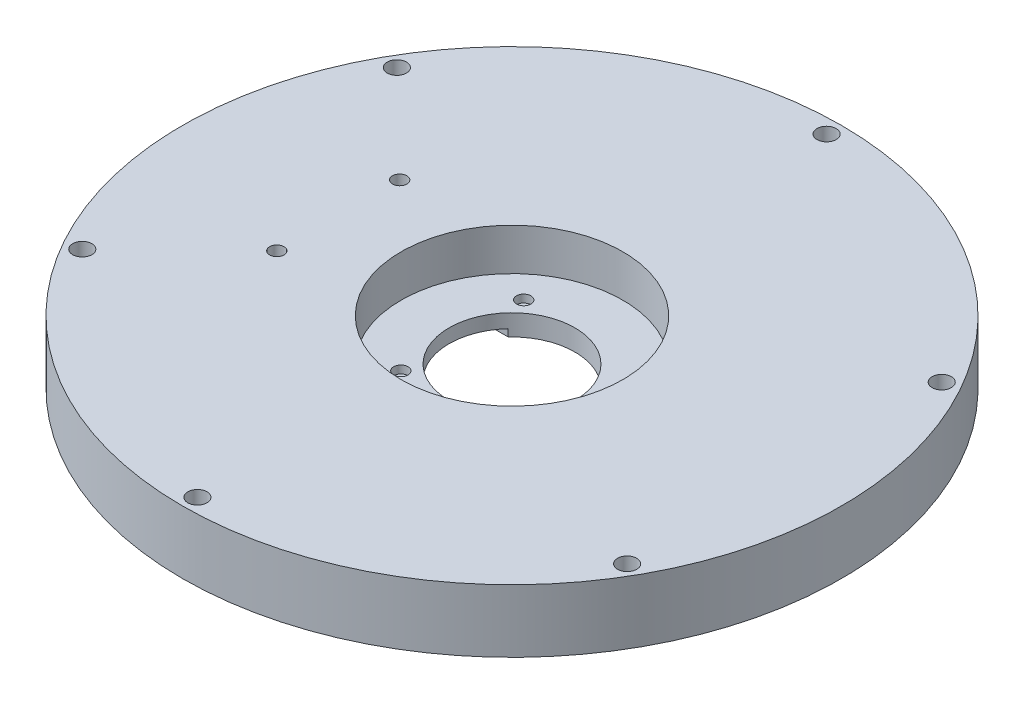
ISO-10303-21;
HEADER;
FILE_DESCRIPTION(('STEP AP214'),'2;1');
FILE_NAME('part.step','',(''),(''),'','','');
FILE_SCHEMA(('AUTOMOTIVE_DESIGN { 1 0 10303 214 1 1 1 1 }'));
ENDSEC;
DATA;
#1=APPLICATION_CONTEXT('core data for automotive mechanical design processes');
#2=APPLICATION_PROTOCOL_DEFINITION('international standard','automotive_design',2000,#1);
#3=PRODUCT_CONTEXT('',#1,'mechanical');
#4=PRODUCT('Part','Part','',(#3));
#5=PRODUCT_RELATED_PRODUCT_CATEGORY('part','',(#4));
#6=PRODUCT_DEFINITION_FORMATION('','',#4);
#7=PRODUCT_DEFINITION_CONTEXT('part definition',#1,'design');
#8=PRODUCT_DEFINITION('design','',#6,#7);
#9=PRODUCT_DEFINITION_SHAPE('','',#8);
#10=(LENGTH_UNIT() NAMED_UNIT(*) SI_UNIT(.MILLI.,.METRE.));
#11=(NAMED_UNIT(*) PLANE_ANGLE_UNIT() SI_UNIT($,.RADIAN.));
#12=(NAMED_UNIT(*) SI_UNIT($,.STERADIAN.) SOLID_ANGLE_UNIT());
#13=UNCERTAINTY_MEASURE_WITH_UNIT(LENGTH_MEASURE(1.E-05),#10,'distance_accuracy_value','');
#14=(GEOMETRIC_REPRESENTATION_CONTEXT(3) GLOBAL_UNCERTAINTY_ASSIGNED_CONTEXT((#13)) GLOBAL_UNIT_ASSIGNED_CONTEXT((#10,
#11,#12)) REPRESENTATION_CONTEXT('',''));
#15=CARTESIAN_POINT('',(0.,0.,0.));
#16=DIRECTION('',(0.,0.,1.));
#17=DIRECTION('',(1.,0.,0.));
#18=AXIS2_PLACEMENT_3D('',#15,#16,#17);
#19=CARTESIAN_POINT('',(0.,-7.5,0.));
#20=DIRECTION('',(0.,1.,0.));
#21=DIRECTION('',(0.,0.,1.));
#22=AXIS2_PLACEMENT_3D('',#19,#20,#21);
#23=CYLINDRICAL_SURFACE('',#22,10.5);
#24=DIRECTION('',(0.,-1.,0.));
#25=VECTOR('',#24,1.);
#26=CARTESIAN_POINT('',(-7.73563184232549,-6.3,7.1));
#27=LINE('',#26,#25);
#28=CARTESIAN_POINT('',(-7.73563184232549,-6.3,7.1));
#29=VERTEX_POINT('',#28);
#30=CARTESIAN_POINT('',(-7.73563184232549,-7.5,7.1));
#31=VERTEX_POINT('',#30);
#32=EDGE_CURVE('E130',#29,#31,#27,.T.);
#33=ORIENTED_EDGE('',*,*,#32,.F.);
#34=CARTESIAN_POINT('',(0.,-6.3,0.));
#35=DIRECTION('',(0.,-1.,0.));
#36=DIRECTION('',(0.,0.,-1.));
#37=AXIS2_PLACEMENT_3D('',#34,#35,#36);
#38=CIRCLE('',#37,10.5);
#39=CARTESIAN_POINT('',(-7.73563184232548,-6.3,-7.1));
#40=VERTEX_POINT('',#39);
#41=EDGE_CURVE('E106',#40,#29,#38,.F.);
#42=ORIENTED_EDGE('',*,*,#41,.F.);
#43=DIRECTION('',(0.,-1.,0.));
#44=VECTOR('',#43,1.);
#45=CARTESIAN_POINT('',(-7.73563184232548,-6.3,-7.1));
#46=LINE('',#45,#44);
#47=CARTESIAN_POINT('',(-7.73563184232548,-7.5,-7.1));
#48=VERTEX_POINT('',#47);
#49=EDGE_CURVE('E104',#40,#48,#46,.T.);
#50=ORIENTED_EDGE('',*,*,#49,.T.);
#51=CARTESIAN_POINT('',(0.,-7.5,0.));
#52=DIRECTION('',(0.,1.,0.));
#53=DIRECTION('',(0.,0.,1.));
#54=AXIS2_PLACEMENT_3D('',#51,#52,#53);
#55=CIRCLE('',#54,10.5);
#56=EDGE_CURVE('E168',#31,#48,#55,.T.);
#57=ORIENTED_EDGE('',*,*,#56,.F.);
#58=EDGE_LOOP('',(#33,#42,#50,#57));
#59=FACE_BOUND('',#58,.T.);
#60=CARTESIAN_POINT('',(0.,-4.,0.));
#61=DIRECTION('',(0.,1.,0.));
#62=DIRECTION('',(0.,0.,1.));
#63=AXIS2_PLACEMENT_3D('',#60,#61,#62);
#64=CIRCLE('',#63,10.5);
#65=CARTESIAN_POINT('',(0.,-4.,10.5));
#66=VERTEX_POINT('',#65);
#67=EDGE_CURVE('E120',#66,#66,#64,.F.);
#68=ORIENTED_EDGE('',*,*,#67,.F.);
#69=EDGE_LOOP('',(#68));
#70=FACE_BOUND('',#69,.T.);
#71=ADVANCED_FACE('F55',(#59,#70),#23,.F.);
#72=CARTESIAN_POINT('',(-8.3,-10.8941125496954,10.25));
#73=DIRECTION('',(0.,1.,0.));
#74=DIRECTION('',(0.,0.,1.));
#75=AXIS2_PLACEMENT_3D('',#72,#73,#74);
#76=CYLINDRICAL_SURFACE('',#75,1.2);
#77=CARTESIAN_POINT('',(-8.3,-5.3,10.25));
#78=DIRECTION('',(0.,1.,0.));
#79=DIRECTION('',(0.,0.,1.));
#80=AXIS2_PLACEMENT_3D('',#77,#78,#79);
#81=CIRCLE('',#80,1.2);
#82=CARTESIAN_POINT('',(-8.3,-5.3,11.45));
#83=VERTEX_POINT('',#82);
#84=EDGE_CURVE('E141',#83,#83,#81,.T.);
#85=ORIENTED_EDGE('',*,*,#84,.F.);
#86=EDGE_LOOP('',(#85));
#87=FACE_BOUND('',#86,.T.);
#88=CARTESIAN_POINT('',(-8.3,-4.,10.25));
#89=DIRECTION('',(0.,1.,0.));
#90=DIRECTION('',(0.,0.,1.));
#91=AXIS2_PLACEMENT_3D('',#88,#89,#90);
#92=CIRCLE('',#91,1.2);
#93=CARTESIAN_POINT('',(-8.3,-4.,11.45));
#94=VERTEX_POINT('',#93);
#95=EDGE_CURVE('E229',#94,#94,#92,.T.);
#96=ORIENTED_EDGE('',*,*,#95,.T.);
#97=EDGE_LOOP('',(#96));
#98=FACE_BOUND('',#97,.T.);
#99=ADVANCED_FACE('F242',(#87,#98),#76,.F.);
#100=CARTESIAN_POINT('',(-8.3,-10.8941125496954,-10.25));
#101=DIRECTION('',(0.,1.,0.));
#102=DIRECTION('',(0.,0.,1.));
#103=AXIS2_PLACEMENT_3D('',#100,#101,#102);
#104=CYLINDRICAL_SURFACE('',#103,1.2);
#105=CARTESIAN_POINT('',(-8.3,-5.3,-10.25));
#106=DIRECTION('',(0.,1.,0.));
#107=DIRECTION('',(0.,0.,1.));
#108=AXIS2_PLACEMENT_3D('',#105,#106,#107);
#109=CIRCLE('',#108,1.2);
#110=CARTESIAN_POINT('',(-8.3,-5.3,-9.05));
#111=VERTEX_POINT('',#110);
#112=EDGE_CURVE('E136',#111,#111,#109,.F.);
#113=ORIENTED_EDGE('',*,*,#112,.T.);
#114=EDGE_LOOP('',(#113));
#115=FACE_BOUND('',#114,.T.);
#116=CARTESIAN_POINT('',(-8.3,-4.,-10.25));
#117=DIRECTION('',(0.,1.,0.));
#118=DIRECTION('',(0.,0.,1.));
#119=AXIS2_PLACEMENT_3D('',#116,#117,#118);
#120=CIRCLE('',#119,1.2);
#121=CARTESIAN_POINT('',(-8.3,-4.,-9.05));
#122=VERTEX_POINT('',#121);
#123=EDGE_CURVE('E59',#122,#122,#120,.F.);
#124=ORIENTED_EDGE('',*,*,#123,.F.);
#125=EDGE_LOOP('',(#124));
#126=FACE_BOUND('',#125,.T.);
#127=ADVANCED_FACE('F240',(#115,#126),#104,.F.);
#128=CARTESIAN_POINT('',(0.,-7.5,0.));
#129=DIRECTION('',(0.,1.,0.));
#130=DIRECTION('',(0.,0.,1.));
#131=AXIS2_PLACEMENT_3D('',#128,#129,#130);
#132=PLANE('',#131);
#133=CARTESIAN_POINT('',(-29.,-7.5,10.25));
#134=DIRECTION('',(0.,1.,0.));
#135=DIRECTION('',(0.,0.,1.));
#136=AXIS2_PLACEMENT_3D('',#133,#134,#135);
#137=CIRCLE('',#136,0.499999999999999);
#138=CARTESIAN_POINT('',(-29.,-7.5,10.75));
#139=VERTEX_POINT('',#138);
#140=EDGE_CURVE('E156',#139,#139,#137,.T.);
#141=ORIENTED_EDGE('',*,*,#140,.T.);
#142=EDGE_LOOP('',(#141));
#143=FACE_BOUND('',#142,.T.);
#144=CARTESIAN_POINT('',(-8.3,-7.5,10.25));
#145=DIRECTION('',(0.,1.,0.));
#146=DIRECTION('',(0.,0.,1.));
#147=AXIS2_PLACEMENT_3D('',#144,#145,#146);
#148=CIRCLE('',#147,0.500000000000001);
#149=CARTESIAN_POINT('',(-8.3,-7.5,10.75));
#150=VERTEX_POINT('',#149);
#151=EDGE_CURVE('E161',#150,#150,#148,.T.);
#152=ORIENTED_EDGE('',*,*,#151,.T.);
#153=EDGE_LOOP('',(#152));
#154=FACE_BOUND('',#153,.T.);
#155=CARTESIAN_POINT('',(0.,-7.5,0.));
#156=DIRECTION('',(0.,1.,0.));
#157=DIRECTION('',(0.,0.,1.));
#158=AXIS2_PLACEMENT_3D('',#155,#156,#157);
#159=CIRCLE('',#158,55.);
#160=CARTESIAN_POINT('',(0.,-7.5,55.));
#161=VERTEX_POINT('',#160);
#162=EDGE_CURVE('E13',#161,#161,#159,.T.);
#163=ORIENTED_EDGE('',*,*,#162,.F.);
#164=EDGE_LOOP('',(#163));
#165=FACE_BOUND('',#164,.T.);
#166=CARTESIAN_POINT('',(45.4663336986831,-7.5,-26.2499999999999));
#167=DIRECTION('',(0.,1.,0.));
#168=DIRECTION('',(0.,0.,1.));
#169=AXIS2_PLACEMENT_3D('',#166,#167,#168);
#170=CIRCLE('',#169,1.6);
#171=CARTESIAN_POINT('',(45.4663336986831,-7.5,-24.6499999999999));
#172=VERTEX_POINT('',#171);
#173=EDGE_CURVE('E64',#172,#172,#170,.T.);
#174=ORIENTED_EDGE('',*,*,#173,.T.);
#175=EDGE_LOOP('',(#174));
#176=FACE_BOUND('',#175,.T.);
#177=CARTESIAN_POINT('',(45.4663336986829,-7.5,26.2500000000002));
#178=DIRECTION('',(0.,1.,0.));
#179=DIRECTION('',(0.,0.,1.));
#180=AXIS2_PLACEMENT_3D('',#177,#178,#179);
#181=CIRCLE('',#180,1.6);
#182=CARTESIAN_POINT('',(45.4663336986829,-7.5,27.8500000000002));
#183=VERTEX_POINT('',#182);
#184=EDGE_CURVE('E183',#183,#183,#181,.T.);
#185=ORIENTED_EDGE('',*,*,#184,.T.);
#186=EDGE_LOOP('',(#185));
#187=FACE_BOUND('',#186,.T.);
#188=CARTESIAN_POINT('',(-3.66605540578529E-13,-7.5,52.5));
#189=DIRECTION('',(0.,1.,0.));
#190=DIRECTION('',(0.,0.,1.));
#191=AXIS2_PLACEMENT_3D('',#188,#189,#190);
#192=CIRCLE('',#191,1.6);
#193=CARTESIAN_POINT('',(-3.66605540578529E-13,-7.5,54.1));
#194=VERTEX_POINT('',#193);
#195=EDGE_CURVE('E180',#194,#194,#192,.T.);
#196=ORIENTED_EDGE('',*,*,#195,.T.);
#197=EDGE_LOOP('',(#196));
#198=FACE_BOUND('',#197,.T.);
#199=CARTESIAN_POINT('',(-45.4663336986833,-7.5,26.2499999999996));
#200=DIRECTION('',(0.,1.,0.));
#201=DIRECTION('',(0.,0.,1.));
#202=AXIS2_PLACEMENT_3D('',#199,#200,#201);
#203=CIRCLE('',#202,1.6);
#204=CARTESIAN_POINT('',(-45.4663336986833,-7.5,27.8499999999996));
#205=VERTEX_POINT('',#204);
#206=EDGE_CURVE('E177',#205,#205,#203,.T.);
#207=ORIENTED_EDGE('',*,*,#206,.T.);
#208=EDGE_LOOP('',(#207));
#209=FACE_BOUND('',#208,.T.);
#210=CARTESIAN_POINT('',(-45.4663336986827,-7.5,-26.2500000000005));
#211=DIRECTION('',(0.,1.,0.));
#212=DIRECTION('',(0.,0.,1.));
#213=AXIS2_PLACEMENT_3D('',#210,#211,#212);
#214=CIRCLE('',#213,1.6);
#215=CARTESIAN_POINT('',(-45.4663336986827,-7.5,-24.6500000000005));
#216=VERTEX_POINT('',#215);
#217=EDGE_CURVE('E174',#216,#216,#214,.T.);
#218=ORIENTED_EDGE('',*,*,#217,.T.);
#219=EDGE_LOOP('',(#218));
#220=FACE_BOUND('',#219,.T.);
#221=CARTESIAN_POINT('',(0.,-7.5,-52.5));
#222=DIRECTION('',(0.,1.,0.));
#223=DIRECTION('',(0.,0.,1.));
#224=AXIS2_PLACEMENT_3D('',#221,#222,#223);
#225=CIRCLE('',#224,1.6);
#226=CARTESIAN_POINT('',(0.,-7.5,-50.9));
#227=VERTEX_POINT('',#226);
#228=EDGE_CURVE('E171',#227,#227,#225,.T.);
#229=ORIENTED_EDGE('',*,*,#228,.T.);
#230=EDGE_LOOP('',(#229));
#231=FACE_BOUND('',#230,.T.);
#232=CARTESIAN_POINT('',(-29.,-7.5,-10.25));
#233=DIRECTION('',(0.,1.,0.));
#234=DIRECTION('',(0.,0.,1.));
#235=AXIS2_PLACEMENT_3D('',#232,#233,#234);
#236=CIRCLE('',#235,0.499999999999999);
#237=CARTESIAN_POINT('',(-29.,-7.5,-9.75));
#238=VERTEX_POINT('',#237);
#239=EDGE_CURVE('E160',#238,#238,#236,.F.);
#240=ORIENTED_EDGE('',*,*,#239,.F.);
#241=EDGE_LOOP('',(#240));
#242=FACE_BOUND('',#241,.T.);
#243=CARTESIAN_POINT('',(-8.3,-7.5,-10.25));
#244=DIRECTION('',(0.,1.,0.));
#245=DIRECTION('',(0.,0.,1.));
#246=AXIS2_PLACEMENT_3D('',#243,#244,#245);
#247=CIRCLE('',#246,0.500000000000001);
#248=CARTESIAN_POINT('',(-8.3,-7.5,-9.75));
#249=VERTEX_POINT('',#248);
#250=EDGE_CURVE('E157',#249,#249,#247,.F.);
#251=ORIENTED_EDGE('',*,*,#250,.F.);
#252=EDGE_LOOP('',(#251));
#253=FACE_BOUND('',#252,.T.);
#254=DIRECTION('',(1.,0.,0.));
#255=VECTOR('',#254,1.);
#256=CARTESIAN_POINT('',(0.,-7.5,7.1));
#257=LINE('',#256,#255);
#258=CARTESIAN_POINT('',(-34.6,-7.5,7.1));
#259=VERTEX_POINT('',#258);
#260=EDGE_CURVE('E96',#259,#31,#257,.T.);
#261=ORIENTED_EDGE('',*,*,#260,.T.);
#262=ORIENTED_EDGE('',*,*,#56,.T.);
#263=DIRECTION('',(-1.,0.,0.));
#264=VECTOR('',#263,1.);
#265=CARTESIAN_POINT('',(0.,-7.5,-7.1));
#266=LINE('',#265,#264);
#267=CARTESIAN_POINT('',(-34.6,-7.5,-7.1));
#268=VERTEX_POINT('',#267);
#269=EDGE_CURVE('E117',#48,#268,#266,.T.);
#270=ORIENTED_EDGE('',*,*,#269,.T.);
#271=DIRECTION('',(0.,0.,1.));
#272=VECTOR('',#271,1.);
#273=CARTESIAN_POINT('',(-34.6,-7.5,0.));
#274=LINE('',#273,#272);
#275=EDGE_CURVE('E112',#268,#259,#274,.T.);
#276=ORIENTED_EDGE('',*,*,#275,.T.);
#277=EDGE_LOOP('',(#261,#262,#270,#276));
#278=FACE_BOUND('',#277,.T.);
#279=ADVANCED_FACE('F189',(#143,#154,#165,#176,#187,#198,#209,#220,#231,#242,#253,#278),#132,.F.);
#280=CARTESIAN_POINT('',(-29.,-8.9142135623731,-10.25));
#281=DIRECTION('',(0.,1.,0.));
#282=DIRECTION('',(0.,0.,1.));
#283=AXIS2_PLACEMENT_3D('',#280,#281,#282);
#284=CYLINDRICAL_SURFACE('',#283,0.499999999999999);
#285=ORIENTED_EDGE('',*,*,#239,.T.);
#286=EDGE_LOOP('',(#285));
#287=FACE_BOUND('',#286,.T.);
#288=CARTESIAN_POINT('',(-29.,-5.3,-10.25));
#289=DIRECTION('',(0.,1.,0.));
#290=DIRECTION('',(0.,0.,1.));
#291=AXIS2_PLACEMENT_3D('',#288,#289,#290);
#292=CIRCLE('',#291,0.499999999999999);
#293=CARTESIAN_POINT('',(-29.,-5.3,-9.75));
#294=VERTEX_POINT('',#293);
#295=EDGE_CURVE('E140',#294,#294,#292,.F.);
#296=ORIENTED_EDGE('',*,*,#295,.F.);
#297=EDGE_LOOP('',(#296));
#298=FACE_BOUND('',#297,.T.);
#299=ADVANCED_FACE('F250',(#287,#298),#284,.F.);
#300=CARTESIAN_POINT('',(-8.3,-8.9142135623731,-10.25));
#301=DIRECTION('',(0.,1.,0.));
#302=DIRECTION('',(0.,0.,1.));
#303=AXIS2_PLACEMENT_3D('',#300,#301,#302);
#304=CYLINDRICAL_SURFACE('',#303,0.500000000000001);
#305=ORIENTED_EDGE('',*,*,#250,.T.);
#306=EDGE_LOOP('',(#305));
#307=FACE_BOUND('',#306,.T.);
#308=CARTESIAN_POINT('',(-8.3,-5.3,-10.25));
#309=DIRECTION('',(0.,1.,0.));
#310=DIRECTION('',(0.,0.,1.));
#311=AXIS2_PLACEMENT_3D('',#308,#309,#310);
#312=CIRCLE('',#311,0.500000000000001);
#313=CARTESIAN_POINT('',(-8.3,-5.3,-9.75));
#314=VERTEX_POINT('',#313);
#315=EDGE_CURVE('E133',#314,#314,#312,.F.);
#316=ORIENTED_EDGE('',*,*,#315,.F.);
#317=EDGE_LOOP('',(#316));
#318=FACE_BOUND('',#317,.T.);
#319=ADVANCED_FACE('F322',(#307,#318),#304,.F.);
#320=CARTESIAN_POINT('',(-8.3,-8.9142135623731,10.25));
#321=DIRECTION('',(0.,1.,0.));
#322=DIRECTION('',(0.,0.,1.));
#323=AXIS2_PLACEMENT_3D('',#320,#321,#322);
#324=CYLINDRICAL_SURFACE('',#323,0.500000000000001);
#325=ORIENTED_EDGE('',*,*,#151,.F.);
#326=EDGE_LOOP('',(#325));
#327=FACE_BOUND('',#326,.T.);
#328=CARTESIAN_POINT('',(-8.3,-5.3,10.25));
#329=DIRECTION('',(0.,1.,0.));
#330=DIRECTION('',(0.,0.,1.));
#331=AXIS2_PLACEMENT_3D('',#328,#329,#330);
#332=CIRCLE('',#331,0.500000000000001);
#333=CARTESIAN_POINT('',(-8.3,-5.3,10.75));
#334=VERTEX_POINT('',#333);
#335=EDGE_CURVE('E137',#334,#334,#332,.T.);
#336=ORIENTED_EDGE('',*,*,#335,.T.);
#337=EDGE_LOOP('',(#336));
#338=FACE_BOUND('',#337,.T.);
#339=ADVANCED_FACE('F325',(#327,#338),#324,.F.);
#340=CARTESIAN_POINT('',(-29.,-8.9142135623731,10.25));
#341=DIRECTION('',(0.,1.,0.));
#342=DIRECTION('',(0.,0.,1.));
#343=AXIS2_PLACEMENT_3D('',#340,#341,#342);
#344=CYLINDRICAL_SURFACE('',#343,0.499999999999999);
#345=ORIENTED_EDGE('',*,*,#140,.F.);
#346=EDGE_LOOP('',(#345));
#347=FACE_BOUND('',#346,.T.);
#348=CARTESIAN_POINT('',(-29.,-5.3,10.25));
#349=DIRECTION('',(0.,1.,0.));
#350=DIRECTION('',(0.,0.,1.));
#351=AXIS2_PLACEMENT_3D('',#348,#349,#350);
#352=CIRCLE('',#351,0.499999999999999);
#353=CARTESIAN_POINT('',(-29.,-5.3,10.75));
#354=VERTEX_POINT('',#353);
#355=EDGE_CURVE('E144',#354,#354,#352,.T.);
#356=ORIENTED_EDGE('',*,*,#355,.T.);
#357=EDGE_LOOP('',(#356));
#358=FACE_BOUND('',#357,.T.);
#359=ADVANCED_FACE('F196',(#347,#358),#344,.F.);
#360=CARTESIAN_POINT('',(45.4663336986831,-7.5,-26.2499999999999));
#361=DIRECTION('',(0.,1.,0.));
#362=DIRECTION('',(0.,0.,1.));
#363=AXIS2_PLACEMENT_3D('',#360,#361,#362);
#364=CYLINDRICAL_SURFACE('',#363,1.6);
#365=ORIENTED_EDGE('',*,*,#173,.F.);
#366=EDGE_LOOP('',(#365));
#367=FACE_BOUND('',#366,.T.);
#368=CARTESIAN_POINT('',(45.4663336986831,3.,-26.2499999999999));
#369=DIRECTION('',(0.,1.,0.));
#370=DIRECTION('',(0.,0.,1.));
#371=AXIS2_PLACEMENT_3D('',#368,#369,#370);
#372=CIRCLE('',#371,1.6);
#373=CARTESIAN_POINT('',(45.4663336986831,3.,-24.6499999999999));
#374=VERTEX_POINT('',#373);
#375=EDGE_CURVE('E200',#374,#374,#372,.F.);
#376=ORIENTED_EDGE('',*,*,#375,.F.);
#377=EDGE_LOOP('',(#376));
#378=FACE_BOUND('',#377,.T.);
#379=ADVANCED_FACE('F192',(#367,#378),#364,.F.);
#380=CARTESIAN_POINT('',(45.4663336986829,-7.5,26.2500000000002));
#381=DIRECTION('',(0.,1.,0.));
#382=DIRECTION('',(0.,0.,1.));
#383=AXIS2_PLACEMENT_3D('',#380,#381,#382);
#384=CYLINDRICAL_SURFACE('',#383,1.6);
#385=ORIENTED_EDGE('',*,*,#184,.F.);
#386=EDGE_LOOP('',(#385));
#387=FACE_BOUND('',#386,.T.);
#388=CARTESIAN_POINT('',(45.4663336986829,3.,26.2500000000002));
#389=DIRECTION('',(0.,1.,0.));
#390=DIRECTION('',(0.,0.,1.));
#391=AXIS2_PLACEMENT_3D('',#388,#389,#390);
#392=CIRCLE('',#391,1.6);
#393=CARTESIAN_POINT('',(45.4663336986829,3.,27.8500000000002));
#394=VERTEX_POINT('',#393);
#395=EDGE_CURVE('E215',#394,#394,#392,.F.);
#396=ORIENTED_EDGE('',*,*,#395,.F.);
#397=EDGE_LOOP('',(#396));
#398=FACE_BOUND('',#397,.T.);
#399=ADVANCED_FACE('F195',(#387,#398),#384,.F.);
#400=CARTESIAN_POINT('',(-3.66605540578529E-13,-7.5,52.5));
#401=DIRECTION('',(0.,1.,0.));
#402=DIRECTION('',(0.,0.,1.));
#403=AXIS2_PLACEMENT_3D('',#400,#401,#402);
#404=CYLINDRICAL_SURFACE('',#403,1.6);
#405=ORIENTED_EDGE('',*,*,#195,.F.);
#406=EDGE_LOOP('',(#405));
#407=FACE_BOUND('',#406,.T.);
#408=CARTESIAN_POINT('',(-3.66605540578529E-13,3.,52.5));
#409=DIRECTION('',(0.,1.,0.));
#410=DIRECTION('',(0.,0.,1.));
#411=AXIS2_PLACEMENT_3D('',#408,#409,#410);
#412=CIRCLE('',#411,1.6);
#413=CARTESIAN_POINT('',(-3.66605540578529E-13,3.,54.1));
#414=VERTEX_POINT('',#413);
#415=EDGE_CURVE('E203',#414,#414,#412,.F.);
#416=ORIENTED_EDGE('',*,*,#415,.F.);
#417=EDGE_LOOP('',(#416));
#418=FACE_BOUND('',#417,.T.);
#419=ADVANCED_FACE('F275',(#407,#418),#404,.F.);
#420=CARTESIAN_POINT('',(-45.4663336986833,-7.5,26.2499999999996));
#421=DIRECTION('',(0.,1.,0.));
#422=DIRECTION('',(0.,0.,1.));
#423=AXIS2_PLACEMENT_3D('',#420,#421,#422);
#424=CYLINDRICAL_SURFACE('',#423,1.6);
#425=ORIENTED_EDGE('',*,*,#206,.F.);
#426=EDGE_LOOP('',(#425));
#427=FACE_BOUND('',#426,.T.);
#428=CARTESIAN_POINT('',(-45.4663336986833,3.,26.2499999999996));
#429=DIRECTION('',(0.,1.,0.));
#430=DIRECTION('',(0.,0.,1.));
#431=AXIS2_PLACEMENT_3D('',#428,#429,#430);
#432=CIRCLE('',#431,1.6);
#433=CARTESIAN_POINT('',(-45.4663336986833,3.,27.8499999999996));
#434=VERTEX_POINT('',#433);
#435=EDGE_CURVE('E218',#434,#434,#432,.F.);
#436=ORIENTED_EDGE('',*,*,#435,.F.);
#437=EDGE_LOOP('',(#436));
#438=FACE_BOUND('',#437,.T.);
#439=ADVANCED_FACE('F279',(#427,#438),#424,.F.);
#440=CARTESIAN_POINT('',(-45.4663336986827,-7.5,-26.2500000000005));
#441=DIRECTION('',(0.,1.,0.));
#442=DIRECTION('',(0.,0.,1.));
#443=AXIS2_PLACEMENT_3D('',#440,#441,#442);
#444=CYLINDRICAL_SURFACE('',#443,1.6);
#445=ORIENTED_EDGE('',*,*,#217,.F.);
#446=EDGE_LOOP('',(#445));
#447=FACE_BOUND('',#446,.T.);
#448=CARTESIAN_POINT('',(-45.4663336986827,3.,-26.2500000000005));
#449=DIRECTION('',(0.,1.,0.));
#450=DIRECTION('',(0.,0.,1.));
#451=AXIS2_PLACEMENT_3D('',#448,#449,#450);
#452=CIRCLE('',#451,1.6);
#453=CARTESIAN_POINT('',(-45.4663336986827,3.,-24.6500000000005));
#454=VERTEX_POINT('',#453);
#455=EDGE_CURVE('E209',#454,#454,#452,.F.);
#456=ORIENTED_EDGE('',*,*,#455,.F.);
#457=EDGE_LOOP('',(#456));
#458=FACE_BOUND('',#457,.T.);
#459=ADVANCED_FACE('F282',(#447,#458),#444,.F.);
#460=CARTESIAN_POINT('',(0.,-7.5,-52.5));
#461=DIRECTION('',(0.,1.,0.));
#462=DIRECTION('',(0.,0.,1.));
#463=AXIS2_PLACEMENT_3D('',#460,#461,#462);
#464=CYLINDRICAL_SURFACE('',#463,1.6);
#465=ORIENTED_EDGE('',*,*,#228,.F.);
#466=EDGE_LOOP('',(#465));
#467=FACE_BOUND('',#466,.T.);
#468=CARTESIAN_POINT('',(0.,3.,-52.5));
#469=DIRECTION('',(0.,1.,0.));
#470=DIRECTION('',(0.,0.,1.));
#471=AXIS2_PLACEMENT_3D('',#468,#469,#470);
#472=CIRCLE('',#471,1.6);
#473=CARTESIAN_POINT('',(0.,3.,-50.9));
#474=VERTEX_POINT('',#473);
#475=EDGE_CURVE('E221',#474,#474,#472,.F.);
#476=ORIENTED_EDGE('',*,*,#475,.F.);
#477=EDGE_LOOP('',(#476));
#478=FACE_BOUND('',#477,.T.);
#479=ADVANCED_FACE('F57',(#467,#478),#464,.F.);
#480=CARTESIAN_POINT('',(0.,-7.5,0.));
#481=DIRECTION('',(0.,1.,0.));
#482=DIRECTION('',(0.,0.,1.));
#483=AXIS2_PLACEMENT_3D('',#480,#481,#482);
#484=CYLINDRICAL_SURFACE('',#483,55.);
#485=ORIENTED_EDGE('',*,*,#162,.T.);
#486=EDGE_LOOP('',(#485));
#487=FACE_BOUND('',#486,.T.);
#488=CARTESIAN_POINT('',(0.,3.,0.));
#489=DIRECTION('',(0.,1.,0.));
#490=DIRECTION('',(0.,0.,1.));
#491=AXIS2_PLACEMENT_3D('',#488,#489,#490);
#492=CIRCLE('',#491,55.);
#493=CARTESIAN_POINT('',(0.,3.,55.));
#494=VERTEX_POINT('',#493);
#495=EDGE_CURVE('E206',#494,#494,#492,.T.);
#496=ORIENTED_EDGE('',*,*,#495,.F.);
#497=EDGE_LOOP('',(#496));
#498=FACE_BOUND('',#497,.T.);
#499=ADVANCED_FACE('F268',(#487,#498),#484,.T.);
#500=CARTESIAN_POINT('',(-29.,-10.8941125496954,10.25));
#501=DIRECTION('',(0.,1.,0.));
#502=DIRECTION('',(0.,0.,1.));
#503=AXIS2_PLACEMENT_3D('',#500,#501,#502);
#504=CYLINDRICAL_SURFACE('',#503,1.2);
#505=CARTESIAN_POINT('',(-29.,-5.3,10.25));
#506=DIRECTION('',(0.,1.,0.));
#507=DIRECTION('',(0.,0.,1.));
#508=AXIS2_PLACEMENT_3D('',#505,#506,#507);
#509=CIRCLE('',#508,1.2);
#510=CARTESIAN_POINT('',(-29.,-5.3,11.45));
#511=VERTEX_POINT('',#510);
#512=EDGE_CURVE('E129',#511,#511,#509,.T.);
#513=ORIENTED_EDGE('',*,*,#512,.F.);
#514=EDGE_LOOP('',(#513));
#515=FACE_BOUND('',#514,.T.);
#516=CARTESIAN_POINT('',(-29.,3.,10.25));
#517=DIRECTION('',(0.,1.,0.));
#518=DIRECTION('',(0.,0.,1.));
#519=AXIS2_PLACEMENT_3D('',#516,#517,#518);
#520=CIRCLE('',#519,1.2);
#521=CARTESIAN_POINT('',(-29.,3.,11.45));
#522=VERTEX_POINT('',#521);
#523=EDGE_CURVE('E202',#522,#522,#520,.F.);
#524=ORIENTED_EDGE('',*,*,#523,.F.);
#525=EDGE_LOOP('',(#524));
#526=FACE_BOUND('',#525,.T.);
#527=ADVANCED_FACE('F270',(#515,#526),#504,.F.);
#528=CARTESIAN_POINT('',(0.,-5.3,0.));
#529=DIRECTION('',(0.,1.,0.));
#530=DIRECTION('',(0.,0.,1.));
#531=AXIS2_PLACEMENT_3D('',#528,#529,#530);
#532=PLANE('',#531);
#533=ORIENTED_EDGE('',*,*,#355,.F.);
#534=EDGE_LOOP('',(#533));
#535=FACE_BOUND('',#534,.T.);
#536=ORIENTED_EDGE('',*,*,#512,.T.);
#537=EDGE_LOOP('',(#536));
#538=FACE_BOUND('',#537,.T.);
#539=ADVANCED_FACE('F319',(#535,#538),#532,.T.);
#540=CARTESIAN_POINT('',(0.,-5.3,0.));
#541=DIRECTION('',(0.,1.,0.));
#542=DIRECTION('',(0.,0.,1.));
#543=AXIS2_PLACEMENT_3D('',#540,#541,#542);
#544=PLANE('',#543);
#545=ORIENTED_EDGE('',*,*,#335,.F.);
#546=EDGE_LOOP('',(#545));
#547=FACE_BOUND('',#546,.T.);
#548=ORIENTED_EDGE('',*,*,#84,.T.);
#549=EDGE_LOOP('',(#548));
#550=FACE_BOUND('',#549,.T.);
#551=ADVANCED_FACE('F316',(#547,#550),#544,.T.);
#552=CARTESIAN_POINT('',(0.,-5.3,0.));
#553=DIRECTION('',(0.,1.,0.));
#554=DIRECTION('',(0.,0.,1.));
#555=AXIS2_PLACEMENT_3D('',#552,#553,#554);
#556=PLANE('',#555);
#557=ORIENTED_EDGE('',*,*,#112,.F.);
#558=EDGE_LOOP('',(#557));
#559=FACE_BOUND('',#558,.T.);
#560=ORIENTED_EDGE('',*,*,#315,.T.);
#561=EDGE_LOOP('',(#560));
#562=FACE_BOUND('',#561,.T.);
#563=ADVANCED_FACE('F305',(#559,#562),#556,.T.);
#564=CARTESIAN_POINT('',(-29.,-10.8941125496954,-10.25));
#565=DIRECTION('',(0.,1.,0.));
#566=DIRECTION('',(0.,0.,1.));
#567=AXIS2_PLACEMENT_3D('',#564,#565,#566);
#568=CYLINDRICAL_SURFACE('',#567,1.2);
#569=CARTESIAN_POINT('',(-29.,-5.3,-10.25));
#570=DIRECTION('',(0.,1.,0.));
#571=DIRECTION('',(0.,0.,1.));
#572=AXIS2_PLACEMENT_3D('',#569,#570,#571);
#573=CIRCLE('',#572,1.2);
#574=CARTESIAN_POINT('',(-29.,-5.3,-9.05));
#575=VERTEX_POINT('',#574);
#576=EDGE_CURVE('E153',#575,#575,#573,.F.);
#577=ORIENTED_EDGE('',*,*,#576,.T.);
#578=EDGE_LOOP('',(#577));
#579=FACE_BOUND('',#578,.T.);
#580=CARTESIAN_POINT('',(-29.,3.,-10.25));
#581=DIRECTION('',(0.,1.,0.));
#582=DIRECTION('',(0.,0.,1.));
#583=AXIS2_PLACEMENT_3D('',#580,#581,#582);
#584=CIRCLE('',#583,1.2);
#585=CARTESIAN_POINT('',(-29.,3.,-9.05));
#586=VERTEX_POINT('',#585);
#587=EDGE_CURVE('E295',#586,#586,#584,.F.);
#588=ORIENTED_EDGE('',*,*,#587,.F.);
#589=EDGE_LOOP('',(#588));
#590=FACE_BOUND('',#589,.T.);
#591=ADVANCED_FACE('F302',(#579,#590),#568,.F.);
#592=CARTESIAN_POINT('',(0.,-5.3,0.));
#593=DIRECTION('',(0.,1.,0.));
#594=DIRECTION('',(0.,0.,1.));
#595=AXIS2_PLACEMENT_3D('',#592,#593,#594);
#596=PLANE('',#595);
#597=ORIENTED_EDGE('',*,*,#576,.F.);
#598=EDGE_LOOP('',(#597));
#599=FACE_BOUND('',#598,.T.);
#600=ORIENTED_EDGE('',*,*,#295,.T.);
#601=EDGE_LOOP('',(#600));
#602=FACE_BOUND('',#601,.T.);
#603=ADVANCED_FACE('F304',(#599,#602),#596,.T.);
#604=CARTESIAN_POINT('',(-34.6,-6.3,0.));
#605=DIRECTION('',(1.,0.,0.));
#606=DIRECTION('',(0.,0.,-1.));
#607=AXIS2_PLACEMENT_3D('',#604,#605,#606);
#608=PLANE('',#607);
#609=ORIENTED_EDGE('',*,*,#275,.F.);
#610=DIRECTION('',(0.,-1.,0.));
#611=VECTOR('',#610,1.);
#612=CARTESIAN_POINT('',(-34.6,-6.3,-7.1));
#613=LINE('',#612,#611);
#614=CARTESIAN_POINT('',(-34.6,-6.3,-7.1));
#615=VERTEX_POINT('',#614);
#616=EDGE_CURVE('E101',#615,#268,#613,.T.);
#617=ORIENTED_EDGE('',*,*,#616,.F.);
#618=DIRECTION('',(0.,0.,1.));
#619=VECTOR('',#618,1.);
#620=CARTESIAN_POINT('',(-34.6,-6.3,0.));
#621=LINE('',#620,#619);
#622=CARTESIAN_POINT('',(-34.6,-6.3,7.1));
#623=VERTEX_POINT('',#622);
#624=EDGE_CURVE('E107',#615,#623,#621,.T.);
#625=ORIENTED_EDGE('',*,*,#624,.T.);
#626=DIRECTION('',(0.,-1.,0.));
#627=VECTOR('',#626,1.);
#628=CARTESIAN_POINT('',(-34.6,-6.3,7.1));
#629=LINE('',#628,#627);
#630=EDGE_CURVE('E127',#623,#259,#629,.T.);
#631=ORIENTED_EDGE('',*,*,#630,.T.);
#632=EDGE_LOOP('',(#609,#617,#625,#631));
#633=FACE_BOUND('',#632,.T.);
#634=ADVANCED_FACE('F110',(#633),#608,.T.);
#635=CARTESIAN_POINT('',(0.,-6.3,7.1));
#636=DIRECTION('',(0.,0.,-1.));
#637=DIRECTION('',(-1.,0.,0.));
#638=AXIS2_PLACEMENT_3D('',#635,#636,#637);
#639=PLANE('',#638);
#640=ORIENTED_EDGE('',*,*,#260,.F.);
#641=ORIENTED_EDGE('',*,*,#630,.F.);
#642=DIRECTION('',(1.,0.,0.));
#643=VECTOR('',#642,1.);
#644=CARTESIAN_POINT('',(0.,-6.3,7.1));
#645=LINE('',#644,#643);
#646=EDGE_CURVE('E77',#623,#29,#645,.T.);
#647=ORIENTED_EDGE('',*,*,#646,.T.);
#648=ORIENTED_EDGE('',*,*,#32,.T.);
#649=EDGE_LOOP('',(#640,#641,#647,#648));
#650=FACE_BOUND('',#649,.T.);
#651=ADVANCED_FACE('F367',(#650),#639,.T.);
#652=CARTESIAN_POINT('',(0.,-6.3,-7.1));
#653=DIRECTION('',(0.,0.,1.));
#654=DIRECTION('',(1.,0.,0.));
#655=AXIS2_PLACEMENT_3D('',#652,#653,#654);
#656=PLANE('',#655);
#657=ORIENTED_EDGE('',*,*,#269,.F.);
#658=ORIENTED_EDGE('',*,*,#49,.F.);
#659=DIRECTION('',(-1.,0.,0.));
#660=VECTOR('',#659,1.);
#661=CARTESIAN_POINT('',(0.,-6.3,-7.1));
#662=LINE('',#661,#660);
#663=EDGE_CURVE('E71',#40,#615,#662,.T.);
#664=ORIENTED_EDGE('',*,*,#663,.T.);
#665=ORIENTED_EDGE('',*,*,#616,.T.);
#666=EDGE_LOOP('',(#657,#658,#664,#665));
#667=FACE_BOUND('',#666,.T.);
#668=ADVANCED_FACE('F100',(#667),#656,.T.);
#669=CARTESIAN_POINT('',(0.,-6.3,0.));
#670=DIRECTION('',(0.,-1.,0.));
#671=DIRECTION('',(0.,0.,-1.));
#672=AXIS2_PLACEMENT_3D('',#669,#670,#671);
#673=PLANE('',#672);
#674=ORIENTED_EDGE('',*,*,#624,.F.);
#675=ORIENTED_EDGE('',*,*,#663,.F.);
#676=ORIENTED_EDGE('',*,*,#41,.T.);
#677=ORIENTED_EDGE('',*,*,#646,.F.);
#678=EDGE_LOOP('',(#674,#675,#676,#677));
#679=FACE_BOUND('',#678,.T.);
#680=ADVANCED_FACE('F115',(#679),#673,.T.);
#681=CARTESIAN_POINT('',(0.,-4.,0.));
#682=DIRECTION('',(0.,1.,0.));
#683=DIRECTION('',(0.,0.,1.));
#684=AXIS2_PLACEMENT_3D('',#681,#682,#683);
#685=PLANE('',#684);
#686=ORIENTED_EDGE('',*,*,#95,.F.);
#687=EDGE_LOOP('',(#686));
#688=FACE_BOUND('',#687,.T.);
#689=CARTESIAN_POINT('',(0.,-4.,0.));
#690=DIRECTION('',(0.,1.,0.));
#691=DIRECTION('',(0.,0.,1.));
#692=AXIS2_PLACEMENT_3D('',#689,#690,#691);
#693=CIRCLE('',#692,18.5);
#694=CARTESIAN_POINT('',(0.,-4.,18.5));
#695=VERTEX_POINT('',#694);
#696=EDGE_CURVE('E227',#695,#695,#693,.T.);
#697=ORIENTED_EDGE('',*,*,#696,.T.);
#698=EDGE_LOOP('',(#697));
#699=FACE_BOUND('',#698,.T.);
#700=ORIENTED_EDGE('',*,*,#123,.T.);
#701=EDGE_LOOP('',(#700));
#702=FACE_BOUND('',#701,.T.);
#703=ORIENTED_EDGE('',*,*,#67,.T.);
#704=EDGE_LOOP('',(#703));
#705=FACE_BOUND('',#704,.T.);
#706=ADVANCED_FACE('F237',(#688,#699,#702,#705),#685,.T.);
#707=CARTESIAN_POINT('',(0.,-4.,0.));
#708=DIRECTION('',(0.,1.,0.));
#709=DIRECTION('',(0.,0.,1.));
#710=AXIS2_PLACEMENT_3D('',#707,#708,#709);
#711=CYLINDRICAL_SURFACE('',#710,18.5);
#712=ORIENTED_EDGE('',*,*,#696,.F.);
#713=EDGE_LOOP('',(#712));
#714=FACE_BOUND('',#713,.T.);
#715=CARTESIAN_POINT('',(0.,3.,0.));
#716=DIRECTION('',(0.,1.,0.));
#717=DIRECTION('',(0.,0.,1.));
#718=AXIS2_PLACEMENT_3D('',#715,#716,#717);
#719=CIRCLE('',#718,18.5);
#720=CARTESIAN_POINT('',(0.,3.,18.5));
#721=VERTEX_POINT('',#720);
#722=EDGE_CURVE('E224',#721,#721,#719,.F.);
#723=ORIENTED_EDGE('',*,*,#722,.F.);
#724=EDGE_LOOP('',(#723));
#725=FACE_BOUND('',#724,.T.);
#726=ADVANCED_FACE('F346',(#714,#725),#711,.F.);
#727=CARTESIAN_POINT('',(0.,3.,0.));
#728=DIRECTION('',(0.,1.,0.));
#729=DIRECTION('',(0.,0.,1.));
#730=AXIS2_PLACEMENT_3D('',#727,#728,#729);
#731=PLANE('',#730);
#732=ORIENTED_EDGE('',*,*,#587,.T.);
#733=EDGE_LOOP('',(#732));
#734=FACE_BOUND('',#733,.T.);
#735=ORIENTED_EDGE('',*,*,#455,.T.);
#736=EDGE_LOOP('',(#735));
#737=FACE_BOUND('',#736,.T.);
#738=ORIENTED_EDGE('',*,*,#415,.T.);
#739=EDGE_LOOP('',(#738));
#740=FACE_BOUND('',#739,.T.);
#741=ORIENTED_EDGE('',*,*,#375,.T.);
#742=EDGE_LOOP('',(#741));
#743=FACE_BOUND('',#742,.T.);
#744=ORIENTED_EDGE('',*,*,#523,.T.);
#745=EDGE_LOOP('',(#744));
#746=FACE_BOUND('',#745,.T.);
#747=ORIENTED_EDGE('',*,*,#495,.T.);
#748=EDGE_LOOP('',(#747));
#749=FACE_BOUND('',#748,.T.);
#750=ORIENTED_EDGE('',*,*,#395,.T.);
#751=EDGE_LOOP('',(#750));
#752=FACE_BOUND('',#751,.T.);
#753=ORIENTED_EDGE('',*,*,#435,.T.);
#754=EDGE_LOOP('',(#753));
#755=FACE_BOUND('',#754,.T.);
#756=ORIENTED_EDGE('',*,*,#475,.T.);
#757=EDGE_LOOP('',(#756));
#758=FACE_BOUND('',#757,.T.);
#759=ORIENTED_EDGE('',*,*,#722,.T.);
#760=EDGE_LOOP('',(#759));
#761=FACE_BOUND('',#760,.T.);
#762=ADVANCED_FACE('F300',(#734,#737,#740,#743,#746,#749,#752,#755,#758,#761),#731,.T.);
#763=CLOSED_SHELL('',(#71,#99,#127,#279,#299,#319,#339,#359,#379,#399,#419,#439,#459,#479,#499,
#527,#539,#551,#563,#591,#603,#634,#651,#668,#680,#706,#726,#762));
#764=MANIFOLD_SOLID_BREP('B2',#763);
#765=ADVANCED_BREP_SHAPE_REPRESENTATION('',(#18,#764),#14);
#766=SHAPE_DEFINITION_REPRESENTATION(#9,#765);
ENDSEC;
END-ISO-10303-21;
